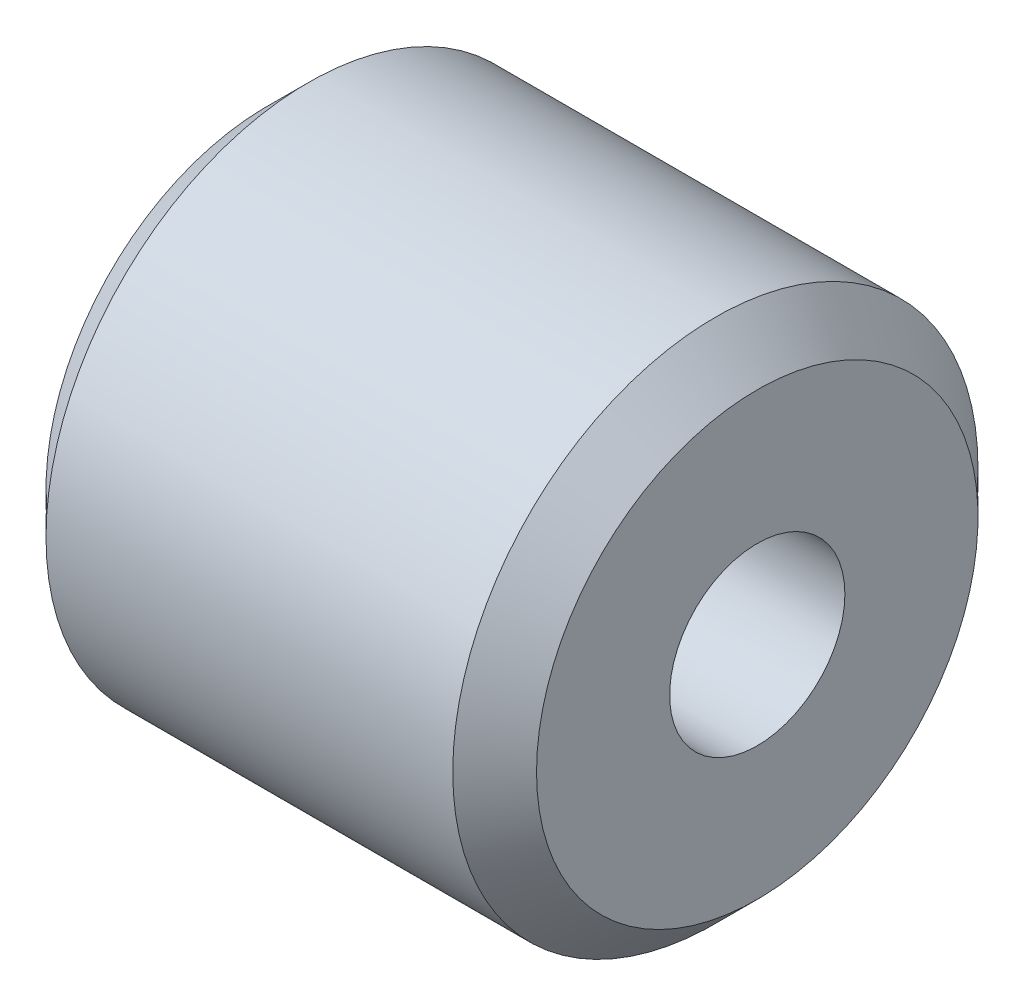
ISO-10303-21;
HEADER;
FILE_DESCRIPTION(('STEP AP214'),'2;1');
FILE_NAME('part.step','',(''),(''),'','','');
FILE_SCHEMA(('AUTOMOTIVE_DESIGN { 1 0 10303 214 1 1 1 1 }'));
ENDSEC;
DATA;
#1=APPLICATION_CONTEXT('core data for automotive mechanical design processes');
#2=APPLICATION_PROTOCOL_DEFINITION('international standard','automotive_design',2000,#1);
#3=PRODUCT_CONTEXT('',#1,'mechanical');
#4=PRODUCT('Part','Part','',(#3));
#5=PRODUCT_RELATED_PRODUCT_CATEGORY('part','',(#4));
#6=PRODUCT_DEFINITION_FORMATION('','',#4);
#7=PRODUCT_DEFINITION_CONTEXT('part definition',#1,'design');
#8=PRODUCT_DEFINITION('design','',#6,#7);
#9=PRODUCT_DEFINITION_SHAPE('','',#8);
#10=(LENGTH_UNIT() NAMED_UNIT(*) SI_UNIT(.MILLI.,.METRE.));
#11=(NAMED_UNIT(*) PLANE_ANGLE_UNIT() SI_UNIT($,.RADIAN.));
#12=(NAMED_UNIT(*) SI_UNIT($,.STERADIAN.) SOLID_ANGLE_UNIT());
#13=UNCERTAINTY_MEASURE_WITH_UNIT(LENGTH_MEASURE(1.E-05),#10,'distance_accuracy_value','');
#14=(GEOMETRIC_REPRESENTATION_CONTEXT(3) GLOBAL_UNCERTAINTY_ASSIGNED_CONTEXT((#13)) GLOBAL_UNIT_ASSIGNED_CONTEXT((#10,
#11,#12)) REPRESENTATION_CONTEXT('',''));
#15=CARTESIAN_POINT('',(0.,0.,0.));
#16=DIRECTION('',(0.,0.,1.));
#17=DIRECTION('',(1.,0.,0.));
#18=AXIS2_PLACEMENT_3D('',#15,#16,#17);
#19=CARTESIAN_POINT('',(4.45,0.,0.));
#20=DIRECTION('',(1.,0.,0.));
#21=DIRECTION('',(0.,0.,-1.));
#22=AXIS2_PLACEMENT_3D('',#19,#20,#21);
#23=PLANE('',#22);
#24=CARTESIAN_POINT('',(4.45,0.,0.));
#25=DIRECTION('',(1.,0.,0.));
#26=DIRECTION('',(0.,0.,-1.));
#27=AXIS2_PLACEMENT_3D('',#24,#25,#26);
#28=CIRCLE('',#27,4.005);
#29=CARTESIAN_POINT('',(4.45,0.,4.005));
#30=VERTEX_POINT('',#29);
#31=EDGE_CURVE('E10',#30,#30,#28,.T.);
#32=ORIENTED_EDGE('',*,*,#31,.T.);
#33=EDGE_LOOP('',(#32));
#34=FACE_BOUND('',#33,.T.);
#35=CARTESIAN_POINT('',(4.45,0.,0.));
#36=DIRECTION('',(1.,0.,0.));
#37=DIRECTION('',(0.,0.,-1.));
#38=AXIS2_PLACEMENT_3D('',#35,#36,#37);
#39=CIRCLE('',#38,1.59);
#40=CARTESIAN_POINT('',(4.45,0.,-1.59));
#41=VERTEX_POINT('',#40);
#42=EDGE_CURVE('E51',#41,#41,#39,.T.);
#43=ORIENTED_EDGE('',*,*,#42,.F.);
#44=EDGE_LOOP('',(#43));
#45=FACE_BOUND('',#44,.T.);
#46=ADVANCED_FACE('F31',(#34,#45),#23,.T.);
#47=CARTESIAN_POINT('',(-4.45,0.,0.));
#48=DIRECTION('',(1.,0.,0.));
#49=DIRECTION('',(0.,0.,-1.));
#50=AXIS2_PLACEMENT_3D('',#47,#48,#49);
#51=PLANE('',#50);
#52=CARTESIAN_POINT('',(-4.45,0.,0.));
#53=DIRECTION('',(1.,0.,0.));
#54=DIRECTION('',(0.,0.,-1.));
#55=AXIS2_PLACEMENT_3D('',#52,#53,#54);
#56=CIRCLE('',#55,4.005);
#57=CARTESIAN_POINT('',(-4.45,0.,-4.005));
#58=VERTEX_POINT('',#57);
#59=EDGE_CURVE('E38',#58,#58,#56,.F.);
#60=ORIENTED_EDGE('',*,*,#59,.T.);
#61=EDGE_LOOP('',(#60));
#62=FACE_BOUND('',#61,.T.);
#63=CARTESIAN_POINT('',(-4.45,0.,0.));
#64=DIRECTION('',(1.,0.,0.));
#65=DIRECTION('',(0.,0.,-1.));
#66=AXIS2_PLACEMENT_3D('',#63,#64,#65);
#67=CIRCLE('',#66,1.59);
#68=CARTESIAN_POINT('',(-4.45,0.,-1.59));
#69=VERTEX_POINT('',#68);
#70=EDGE_CURVE('E52',#69,#69,#67,.T.);
#71=ORIENTED_EDGE('',*,*,#70,.T.);
#72=EDGE_LOOP('',(#71));
#73=FACE_BOUND('',#72,.T.);
#74=ADVANCED_FACE('F62',(#62,#73),#51,.F.);
#75=CARTESIAN_POINT('',(4.45,0.,0.));
#76=DIRECTION('',(-1.,0.,0.));
#77=DIRECTION('',(0.,0.,1.));
#78=AXIS2_PLACEMENT_3D('',#75,#76,#77);
#79=CYLINDRICAL_SURFACE('',#78,4.76500000000001);
#80=CARTESIAN_POINT('',(-3.69,0.,0.));
#81=DIRECTION('',(1.,0.,0.));
#82=DIRECTION('',(0.,0.,-1.));
#83=AXIS2_PLACEMENT_3D('',#80,#81,#82);
#84=CIRCLE('',#83,4.76500000000001);
#85=CARTESIAN_POINT('',(-3.69,0.,-4.76500000000001));
#86=VERTEX_POINT('',#85);
#87=EDGE_CURVE('E42',#86,#86,#84,.T.);
#88=ORIENTED_EDGE('',*,*,#87,.T.);
#89=EDGE_LOOP('',(#88));
#90=FACE_BOUND('',#89,.T.);
#91=CARTESIAN_POINT('',(3.68999999999999,0.,0.));
#92=DIRECTION('',(1.,0.,0.));
#93=DIRECTION('',(0.,0.,-1.));
#94=AXIS2_PLACEMENT_3D('',#91,#92,#93);
#95=CIRCLE('',#94,4.76500000000001);
#96=CARTESIAN_POINT('',(3.68999999999999,0.,4.76500000000001));
#97=VERTEX_POINT('',#96);
#98=EDGE_CURVE('E46',#97,#97,#95,.F.);
#99=ORIENTED_EDGE('',*,*,#98,.T.);
#100=EDGE_LOOP('',(#99));
#101=FACE_BOUND('',#100,.T.);
#102=ADVANCED_FACE('F67',(#90,#101),#79,.T.);
#103=CARTESIAN_POINT('',(4.45,0.,0.));
#104=DIRECTION('',(-1.,0.,0.));
#105=DIRECTION('',(0.,0.,1.));
#106=AXIS2_PLACEMENT_3D('',#103,#104,#105);
#107=CYLINDRICAL_SURFACE('',#106,1.59);
#108=ORIENTED_EDGE('',*,*,#42,.T.);
#109=EDGE_LOOP('',(#108));
#110=FACE_BOUND('',#109,.T.);
#111=ORIENTED_EDGE('',*,*,#70,.F.);
#112=EDGE_LOOP('',(#111));
#113=FACE_BOUND('',#112,.T.);
#114=ADVANCED_FACE('F58',(#110,#113),#107,.F.);
#115=CARTESIAN_POINT('',(-3.69,0.,0.));
#116=DIRECTION('',(1.,0.,0.));
#117=DIRECTION('',(0.,0.,-1.));
#118=AXIS2_PLACEMENT_3D('',#115,#116,#117);
#119=CONICAL_SURFACE('',#118,4.76500000000001,0.78539816339745);
#120=ORIENTED_EDGE('',*,*,#59,.F.);
#121=EDGE_LOOP('',(#120));
#122=FACE_BOUND('',#121,.T.);
#123=ORIENTED_EDGE('',*,*,#87,.F.);
#124=EDGE_LOOP('',(#123));
#125=FACE_BOUND('',#124,.T.);
#126=ADVANCED_FACE('F73',(#122,#125),#119,.T.);
#127=CARTESIAN_POINT('',(4.45,0.,0.));
#128=DIRECTION('',(-1.,0.,0.));
#129=DIRECTION('',(0.,0.,1.));
#130=AXIS2_PLACEMENT_3D('',#127,#128,#129);
#131=CONICAL_SURFACE('',#130,4.005,0.785398163397446);
#132=CARTESIAN_POINT('',(3.68999999999999,0.,4.76500000000001));
#133=CARTESIAN_POINT('',(3.69791666666666,0.,4.75708333333334));
#134=CARTESIAN_POINT('',(3.70583333333333,0.,4.74916666666667));
#135=CARTESIAN_POINT('',(3.72166666666666,0.,4.73333333333334));
#136=CARTESIAN_POINT('',(3.72958333333333,0.,4.72541666666667));
#137=CARTESIAN_POINT('',(3.74541666666666,0.,4.70958333333334));
#138=CARTESIAN_POINT('',(3.75333333333333,0.,4.70166666666667));
#139=CARTESIAN_POINT('',(3.76916666666666,0.,4.68583333333334));
#140=CARTESIAN_POINT('',(3.77708333333333,0.,4.67791666666667));
#141=CARTESIAN_POINT('',(3.79291666666666,0.,4.66208333333334));
#142=CARTESIAN_POINT('',(3.80083333333333,0.,4.65416666666667));
#143=CARTESIAN_POINT('',(3.81666666666666,0.,4.63833333333334));
#144=CARTESIAN_POINT('',(3.82458333333333,0.,4.63041666666667));
#145=CARTESIAN_POINT('',(3.84041666666666,0.,4.61458333333334));
#146=CARTESIAN_POINT('',(3.84833333333333,0.,4.60666666666667));
#147=CARTESIAN_POINT('',(3.86416666666666,0.,4.59083333333334));
#148=CARTESIAN_POINT('',(3.87208333333333,0.,4.58291666666667));
#149=CARTESIAN_POINT('',(3.88791666666666,0.,4.56708333333334));
#150=CARTESIAN_POINT('',(3.89583333333333,0.,4.55916666666667));
#151=CARTESIAN_POINT('',(3.91166666666666,0.,4.54333333333334));
#152=CARTESIAN_POINT('',(3.91958333333333,0.,4.53541666666667));
#153=CARTESIAN_POINT('',(3.93541666666666,0.,4.51958333333334));
#154=CARTESIAN_POINT('',(3.94333333333333,0.,4.51166666666667));
#155=CARTESIAN_POINT('',(3.95916666666666,0.,4.49583333333334));
#156=CARTESIAN_POINT('',(3.96708333333333,0.,4.48791666666667));
#157=CARTESIAN_POINT('',(3.98291666666666,0.,4.47208333333334));
#158=CARTESIAN_POINT('',(3.99083333333333,0.,4.46416666666667));
#159=CARTESIAN_POINT('',(4.00666666666666,0.,4.44833333333334));
#160=CARTESIAN_POINT('',(4.01458333333333,0.,4.44041666666667));
#161=CARTESIAN_POINT('',(4.03041666666666,0.,4.42458333333334));
#162=CARTESIAN_POINT('',(4.03833333333333,0.,4.41666666666667));
#163=CARTESIAN_POINT('',(4.05416666666666,0.,4.40083333333334));
#164=CARTESIAN_POINT('',(4.06208333333333,0.,4.39291666666667));
#165=CARTESIAN_POINT('',(4.07791666666666,0.,4.37708333333334));
#166=CARTESIAN_POINT('',(4.08583333333333,0.,4.36916666666667));
#167=CARTESIAN_POINT('',(4.10166666666666,0.,4.35333333333334));
#168=CARTESIAN_POINT('',(4.10958333333333,0.,4.34541666666667));
#169=CARTESIAN_POINT('',(4.12541666666666,0.,4.32958333333334));
#170=CARTESIAN_POINT('',(4.13333333333333,0.,4.32166666666667));
#171=CARTESIAN_POINT('',(4.14916666666666,0.,4.30583333333334));
#172=CARTESIAN_POINT('',(4.15708333333333,0.,4.29791666666667));
#173=CARTESIAN_POINT('',(4.17291666666666,0.,4.28208333333334));
#174=CARTESIAN_POINT('',(4.18083333333333,0.,4.27416666666667));
#175=CARTESIAN_POINT('',(4.19666666666666,0.,4.25833333333334));
#176=CARTESIAN_POINT('',(4.20458333333333,0.,4.25041666666667));
#177=CARTESIAN_POINT('',(4.22041666666666,0.,4.23458333333334));
#178=CARTESIAN_POINT('',(4.22833333333333,0.,4.22666666666667));
#179=CARTESIAN_POINT('',(4.24416666666666,0.,4.21083333333334));
#180=CARTESIAN_POINT('',(4.25208333333333,0.,4.20291666666667));
#181=CARTESIAN_POINT('',(4.26791666666666,0.,4.18708333333334));
#182=CARTESIAN_POINT('',(4.27583333333333,0.,4.17916666666667));
#183=CARTESIAN_POINT('',(4.29166666666667,0.,4.16333333333334));
#184=CARTESIAN_POINT('',(4.29958333333333,0.,4.15541666666667));
#185=CARTESIAN_POINT('',(4.31541666666666,0.,4.13958333333334));
#186=CARTESIAN_POINT('',(4.32333333333333,0.,4.13166666666667));
#187=CARTESIAN_POINT('',(4.33916666666666,0.,4.11583333333334));
#188=CARTESIAN_POINT('',(4.34708333333333,0.,4.10791666666667));
#189=CARTESIAN_POINT('',(4.36291666666667,0.,4.09208333333334));
#190=CARTESIAN_POINT('',(4.37083333333333,0.,4.08416666666667));
#191=CARTESIAN_POINT('',(4.38666666666667,0.,4.06833333333334));
#192=CARTESIAN_POINT('',(4.39458333333333,0.,4.06041666666667));
#193=CARTESIAN_POINT('',(4.41041666666667,0.,4.04458333333334));
#194=CARTESIAN_POINT('',(4.41833333333333,0.,4.03666666666667));
#195=CARTESIAN_POINT('',(4.43416666666667,0.,4.02083333333334));
#196=CARTESIAN_POINT('',(4.44208333333333,0.,4.01291666666667));
#197=CARTESIAN_POINT('',(4.45,0.,4.005));
#198=B_SPLINE_CURVE_WITH_KNOTS('',3,(#132,#133,#134,#135,#136,#137,#138,#139,#140,#141,#142,
#143,#144,#145,#146,#147,#148,#149,#150,#151,#152,#153,#154,#155,#156,#157,#158,#159,#160,#161,
#162,#163,#164,#165,#166,#167,#168,#169,#170,#171,#172,#173,#174,#175,#176,#177,#178,#179,#180,
#181,#182,#183,#184,#185,#186,#187,#188,#189,#190,#191,#192,#193,#194,#195,#196,#197),
.UNSPECIFIED.,.F.,.F.,(4,2,2,2,2,2,2,2,2,2,2,2,2,2,2,2,2,2,2,2,2,2,2,2,2,2,2,2,2,2,2,2,4),(0.,
0.0335875721063615,0.067175144212723,0.100762716319084,0.134350288425445,0.167937860531806,
0.201525432638168,0.235113004744529,0.26870057685089,0.302288148957251,0.335875721063613,
0.369463293169974,0.403050865276335,0.436638437382697,0.470226009489057,0.503813581595418,
0.53740115370178,0.570988725808141,0.604576297914502,0.638163870020863,0.671751442127224,
0.705339014233586,0.738926586339947,0.772514158446308,0.80610173055267,0.83968930265903,
0.873276874765392,0.906864446871753,0.940452018978114,0.974039591084475,1.00762716319084,
1.0412147352972,1.07480230740356),.UNSPECIFIED.);
#199=EDGE_CURVE('BSEAM33',#97,#30,#198,.T.);
#200=ORIENTED_EDGE('',*,*,#98,.F.);
#201=ORIENTED_EDGE('',*,*,#31,.F.);
#202=ORIENTED_EDGE('',*,*,#199,.T.);
#203=ORIENTED_EDGE('',*,*,#199,.F.);
#204=EDGE_LOOP('',(#200,#202,#201,#203));
#205=FACE_BOUND('',#204,.T.);
#206=ADVANCED_FACE('F33',(#205),#131,.T.);
#207=CLOSED_SHELL('',(#46,#74,#102,#114,#126,#206));
#208=MANIFOLD_SOLID_BREP('B2',#207);
#209=ADVANCED_BREP_SHAPE_REPRESENTATION('',(#18,#208),#14);
#210=SHAPE_DEFINITION_REPRESENTATION(#9,#209);
ENDSEC;
END-ISO-10303-21;
